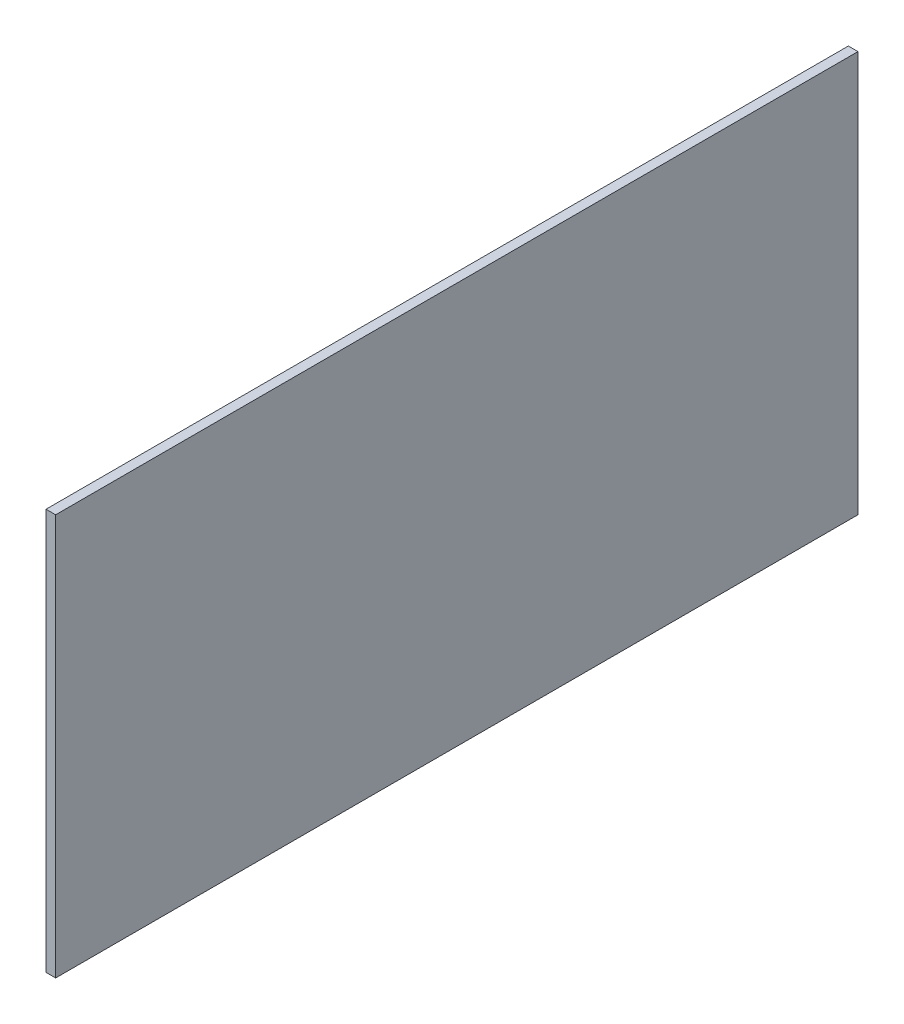
ISO-10303-21;
HEADER;
FILE_DESCRIPTION(('STEP AP214'),'2;1');
FILE_NAME('part.step','',(''),(''),'','','');
FILE_SCHEMA(('AUTOMOTIVE_DESIGN { 1 0 10303 214 1 1 1 1 }'));
ENDSEC;
DATA;
#1=APPLICATION_CONTEXT('core data for automotive mechanical design processes');
#2=APPLICATION_PROTOCOL_DEFINITION('international standard','automotive_design',2000,#1);
#3=PRODUCT_CONTEXT('',#1,'mechanical');
#4=PRODUCT('Part','Part','',(#3));
#5=PRODUCT_RELATED_PRODUCT_CATEGORY('part','',(#4));
#6=PRODUCT_DEFINITION_FORMATION('','',#4);
#7=PRODUCT_DEFINITION_CONTEXT('part definition',#1,'design');
#8=PRODUCT_DEFINITION('design','',#6,#7);
#9=PRODUCT_DEFINITION_SHAPE('','',#8);
#10=(LENGTH_UNIT() NAMED_UNIT(*) SI_UNIT(.MILLI.,.METRE.));
#11=(NAMED_UNIT(*) PLANE_ANGLE_UNIT() SI_UNIT($,.RADIAN.));
#12=(NAMED_UNIT(*) SI_UNIT($,.STERADIAN.) SOLID_ANGLE_UNIT());
#13=UNCERTAINTY_MEASURE_WITH_UNIT(LENGTH_MEASURE(1.E-05),#10,'distance_accuracy_value','');
#14=(GEOMETRIC_REPRESENTATION_CONTEXT(3) GLOBAL_UNCERTAINTY_ASSIGNED_CONTEXT((#13)) GLOBAL_UNIT_ASSIGNED_CONTEXT((#10,
#11,#12)) REPRESENTATION_CONTEXT('',''));
#15=CARTESIAN_POINT('',(0.,0.,0.));
#16=DIRECTION('',(0.,0.,1.));
#17=DIRECTION('',(1.,0.,0.));
#18=AXIS2_PLACEMENT_3D('',#15,#16,#17);
#19=CARTESIAN_POINT('',(0.,0.,0.));
#20=DIRECTION('',(1.,0.,0.));
#21=DIRECTION('',(0.,1.,0.));
#22=AXIS2_PLACEMENT_3D('',#19,#20,#21);
#23=PLANE('',#22);
#24=DIRECTION('',(0.,0.,-1.));
#25=VECTOR('',#24,1.);
#26=CARTESIAN_POINT('',(0.,-62.5,125.));
#27=LINE('',#26,#25);
#28=CARTESIAN_POINT('',(0.,-62.5,125.));
#29=VERTEX_POINT('',#28);
#30=CARTESIAN_POINT('',(0.,-62.5,-125.));
#31=VERTEX_POINT('',#30);
#32=EDGE_CURVE('E27',#29,#31,#27,.T.);
#33=ORIENTED_EDGE('',*,*,#32,.F.);
#34=DIRECTION('',(0.,-1.,0.));
#35=VECTOR('',#34,1.);
#36=CARTESIAN_POINT('',(0.,62.5,125.));
#37=LINE('',#36,#35);
#38=CARTESIAN_POINT('',(0.,62.5,125.));
#39=VERTEX_POINT('',#38);
#40=EDGE_CURVE('E89',#39,#29,#37,.T.);
#41=ORIENTED_EDGE('',*,*,#40,.F.);
#42=DIRECTION('',(0.,0.,1.));
#43=VECTOR('',#42,1.);
#44=CARTESIAN_POINT('',(0.,62.5,-125.));
#45=LINE('',#44,#43);
#46=CARTESIAN_POINT('',(0.,62.5,-125.));
#47=VERTEX_POINT('',#46);
#48=EDGE_CURVE('E71',#47,#39,#45,.T.);
#49=ORIENTED_EDGE('',*,*,#48,.F.);
#50=DIRECTION('',(0.,1.,0.));
#51=VECTOR('',#50,1.);
#52=CARTESIAN_POINT('',(0.,-62.5,-125.));
#53=LINE('',#52,#51);
#54=EDGE_CURVE('E109',#31,#47,#53,.T.);
#55=ORIENTED_EDGE('',*,*,#54,.F.);
#56=EDGE_LOOP('',(#33,#41,#49,#55));
#57=FACE_BOUND('',#56,.T.);
#58=ADVANCED_FACE('F17',(#57),#23,.F.);
#59=CARTESIAN_POINT('',(3.,0.,0.));
#60=DIRECTION('',(1.,0.,0.));
#61=DIRECTION('',(0.,1.,0.));
#62=AXIS2_PLACEMENT_3D('',#59,#60,#61);
#63=PLANE('',#62);
#64=DIRECTION('',(0.,0.,-1.));
#65=VECTOR('',#64,1.);
#66=CARTESIAN_POINT('',(3.,-62.5,125.));
#67=LINE('',#66,#65);
#68=CARTESIAN_POINT('',(3.,-62.5,125.));
#69=VERTEX_POINT('',#68);
#70=CARTESIAN_POINT('',(3.,-62.5,-125.));
#71=VERTEX_POINT('',#70);
#72=EDGE_CURVE('E11',#69,#71,#67,.T.);
#73=ORIENTED_EDGE('',*,*,#72,.T.);
#74=DIRECTION('',(0.,1.,0.));
#75=VECTOR('',#74,1.);
#76=CARTESIAN_POINT('',(3.,-62.5,-125.));
#77=LINE('',#76,#75);
#78=CARTESIAN_POINT('',(3.,62.5,-125.));
#79=VERTEX_POINT('',#78);
#80=EDGE_CURVE('E115',#71,#79,#77,.T.);
#81=ORIENTED_EDGE('',*,*,#80,.T.);
#82=DIRECTION('',(0.,0.,1.));
#83=VECTOR('',#82,1.);
#84=CARTESIAN_POINT('',(3.,62.5,-125.));
#85=LINE('',#84,#83);
#86=CARTESIAN_POINT('',(3.,62.5,125.));
#87=VERTEX_POINT('',#86);
#88=EDGE_CURVE('E82',#79,#87,#85,.T.);
#89=ORIENTED_EDGE('',*,*,#88,.T.);
#90=DIRECTION('',(0.,-1.,0.));
#91=VECTOR('',#90,1.);
#92=CARTESIAN_POINT('',(3.,62.5,125.));
#93=LINE('',#92,#91);
#94=EDGE_CURVE('E93',#87,#69,#93,.T.);
#95=ORIENTED_EDGE('',*,*,#94,.T.);
#96=EDGE_LOOP('',(#73,#81,#89,#95));
#97=FACE_BOUND('',#96,.T.);
#98=ADVANCED_FACE('F123',(#97),#63,.T.);
#99=CARTESIAN_POINT('',(0.,-62.5,125.));
#100=DIRECTION('',(0.,-1.,0.));
#101=DIRECTION('',(0.,0.,-1.));
#102=AXIS2_PLACEMENT_3D('',#99,#100,#101);
#103=PLANE('',#102);
#104=ORIENTED_EDGE('',*,*,#32,.T.);
#105=DIRECTION('',(1.,0.,0.));
#106=VECTOR('',#105,1.);
#107=CARTESIAN_POINT('',(0.,-62.5,-125.));
#108=LINE('',#107,#106);
#109=EDGE_CURVE('E20',#31,#71,#108,.T.);
#110=ORIENTED_EDGE('',*,*,#109,.T.);
#111=ORIENTED_EDGE('',*,*,#72,.F.);
#112=DIRECTION('',(1.,0.,0.));
#113=VECTOR('',#112,1.);
#114=CARTESIAN_POINT('',(0.,-62.5,125.));
#115=LINE('',#114,#113);
#116=EDGE_CURVE('E92',#29,#69,#115,.T.);
#117=ORIENTED_EDGE('',*,*,#116,.F.);
#118=EDGE_LOOP('',(#104,#110,#111,#117));
#119=FACE_BOUND('',#118,.T.);
#120=ADVANCED_FACE('F120',(#119),#103,.T.);
#121=CARTESIAN_POINT('',(0.,-62.5,-125.));
#122=DIRECTION('',(0.,0.,-1.));
#123=DIRECTION('',(0.,-1.,0.));
#124=AXIS2_PLACEMENT_3D('',#121,#122,#123);
#125=PLANE('',#124);
#126=ORIENTED_EDGE('',*,*,#54,.T.);
#127=DIRECTION('',(1.,0.,0.));
#128=VECTOR('',#127,1.);
#129=CARTESIAN_POINT('',(0.,62.5,-125.));
#130=LINE('',#129,#128);
#131=EDGE_CURVE('E78',#47,#79,#130,.T.);
#132=ORIENTED_EDGE('',*,*,#131,.T.);
#133=ORIENTED_EDGE('',*,*,#80,.F.);
#134=ORIENTED_EDGE('',*,*,#109,.F.);
#135=EDGE_LOOP('',(#126,#132,#133,#134));
#136=FACE_BOUND('',#135,.T.);
#137=ADVANCED_FACE('F125',(#136),#125,.T.);
#138=CARTESIAN_POINT('',(0.,62.5,-125.));
#139=DIRECTION('',(0.,1.,0.));
#140=DIRECTION('',(1.,0.,0.));
#141=AXIS2_PLACEMENT_3D('',#138,#139,#140);
#142=PLANE('',#141);
#143=ORIENTED_EDGE('',*,*,#48,.T.);
#144=DIRECTION('',(1.,0.,0.));
#145=VECTOR('',#144,1.);
#146=CARTESIAN_POINT('',(0.,62.5,125.));
#147=LINE('',#146,#145);
#148=EDGE_CURVE('E76',#39,#87,#147,.T.);
#149=ORIENTED_EDGE('',*,*,#148,.T.);
#150=ORIENTED_EDGE('',*,*,#88,.F.);
#151=ORIENTED_EDGE('',*,*,#131,.F.);
#152=EDGE_LOOP('',(#143,#149,#150,#151));
#153=FACE_BOUND('',#152,.T.);
#154=ADVANCED_FACE('F72',(#153),#142,.T.);
#155=CARTESIAN_POINT('',(0.,62.5,125.));
#156=DIRECTION('',(0.,0.,1.));
#157=DIRECTION('',(1.,0.,0.));
#158=AXIS2_PLACEMENT_3D('',#155,#156,#157);
#159=PLANE('',#158);
#160=ORIENTED_EDGE('',*,*,#40,.T.);
#161=ORIENTED_EDGE('',*,*,#116,.T.);
#162=ORIENTED_EDGE('',*,*,#94,.F.);
#163=ORIENTED_EDGE('',*,*,#148,.F.);
#164=EDGE_LOOP('',(#160,#161,#162,#163));
#165=FACE_BOUND('',#164,.T.);
#166=ADVANCED_FACE('F86',(#165),#159,.T.);
#167=CLOSED_SHELL('',(#58,#98,#120,#137,#154,#166));
#168=MANIFOLD_SOLID_BREP('B1',#167);
#169=ADVANCED_BREP_SHAPE_REPRESENTATION('',(#18,#168),#14);
#170=SHAPE_DEFINITION_REPRESENTATION(#9,#169);
ENDSEC;
END-ISO-10303-21;
